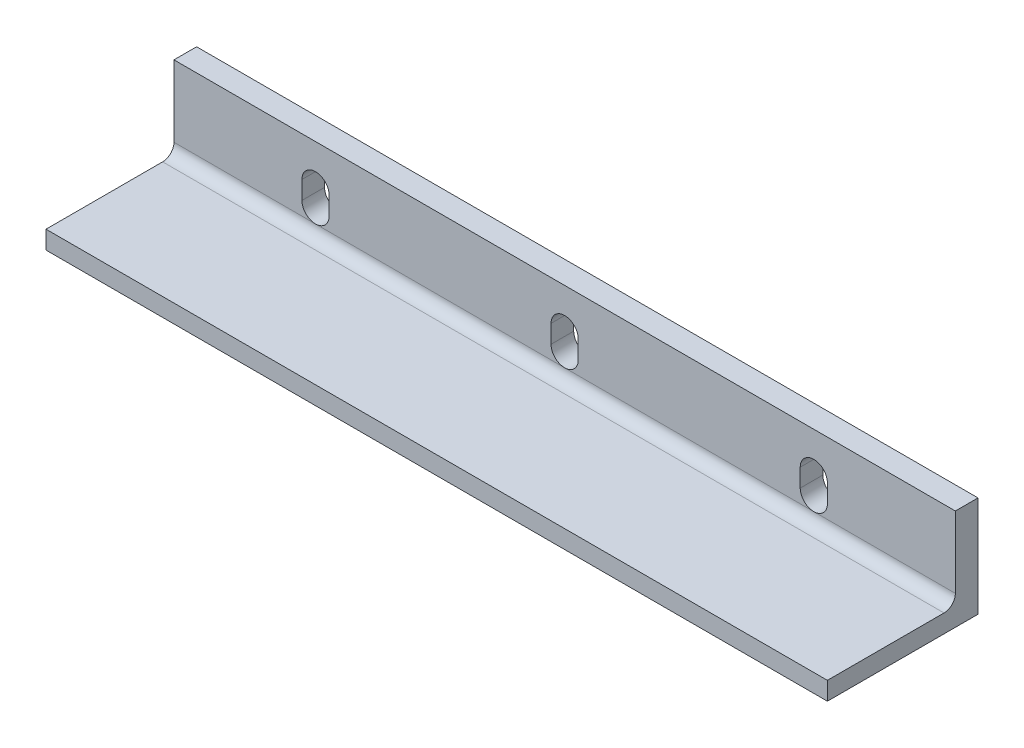
ISO-10303-21;
HEADER;
FILE_DESCRIPTION(('STEP AP214'),'2;1');
FILE_NAME('part.step','',(''),(''),'','','');
FILE_SCHEMA(('AUTOMOTIVE_DESIGN { 1 0 10303 214 1 1 1 1 }'));
ENDSEC;
DATA;
#1=APPLICATION_CONTEXT('core data for automotive mechanical design processes');
#2=APPLICATION_PROTOCOL_DEFINITION('international standard','automotive_design',2000,#1);
#3=PRODUCT_CONTEXT('',#1,'mechanical');
#4=PRODUCT('Part','Part','',(#3));
#5=PRODUCT_RELATED_PRODUCT_CATEGORY('part','',(#4));
#6=PRODUCT_DEFINITION_FORMATION('','',#4);
#7=PRODUCT_DEFINITION_CONTEXT('part definition',#1,'design');
#8=PRODUCT_DEFINITION('design','',#6,#7);
#9=PRODUCT_DEFINITION_SHAPE('','',#8);
#10=(LENGTH_UNIT() NAMED_UNIT(*) SI_UNIT(.MILLI.,.METRE.));
#11=(NAMED_UNIT(*) PLANE_ANGLE_UNIT() SI_UNIT($,.RADIAN.));
#12=(NAMED_UNIT(*) SI_UNIT($,.STERADIAN.) SOLID_ANGLE_UNIT());
#13=UNCERTAINTY_MEASURE_WITH_UNIT(LENGTH_MEASURE(1.E-05),#10,'distance_accuracy_value','');
#14=(GEOMETRIC_REPRESENTATION_CONTEXT(3) GLOBAL_UNCERTAINTY_ASSIGNED_CONTEXT((#13)) GLOBAL_UNIT_ASSIGNED_CONTEXT((#10,
#11,#12)) REPRESENTATION_CONTEXT('',''));
#15=CARTESIAN_POINT('',(0.,0.,0.));
#16=DIRECTION('',(0.,0.,1.));
#17=DIRECTION('',(1.,0.,0.));
#18=AXIS2_PLACEMENT_3D('',#15,#16,#17);
#19=CARTESIAN_POINT('',(-34.5,1.6,-6.65));
#20=DIRECTION('',(0.,0.,1.));
#21=DIRECTION('',(1.,0.,0.));
#22=AXIS2_PLACEMENT_3D('',#19,#20,#21);
#23=PLANE('',#22);
#24=DIRECTION('',(0.,1.,0.));
#25=VECTOR('',#24,1.);
#26=CARTESIAN_POINT('',(-23.2,3.8,-6.65));
#27=LINE('',#26,#25);
#28=CARTESIAN_POINT('',(-23.2,3.8,-6.65));
#29=VERTEX_POINT('',#28);
#30=CARTESIAN_POINT('',(-23.2,5.4,-6.65));
#31=VERTEX_POINT('',#30);
#32=EDGE_CURVE('E422',#29,#31,#27,.T.);
#33=ORIENTED_EDGE('',*,*,#32,.F.);
#34=CARTESIAN_POINT('',(-22.,3.8,-6.65));
#35=DIRECTION('',(0.,0.,1.));
#36=DIRECTION('',(1.,0.,0.));
#37=AXIS2_PLACEMENT_3D('',#34,#35,#36);
#38=CIRCLE('',#37,1.2);
#39=CARTESIAN_POINT('',(-20.8,3.8,-6.65));
#40=VERTEX_POINT('',#39);
#41=EDGE_CURVE('E427',#29,#40,#38,.T.);
#42=ORIENTED_EDGE('',*,*,#41,.T.);
#43=DIRECTION('',(0.,1.,0.));
#44=VECTOR('',#43,1.);
#45=CARTESIAN_POINT('',(-20.8,3.8,-6.65));
#46=LINE('',#45,#44);
#47=CARTESIAN_POINT('',(-20.8,5.4,-6.65));
#48=VERTEX_POINT('',#47);
#49=EDGE_CURVE('E413',#40,#48,#46,.T.);
#50=ORIENTED_EDGE('',*,*,#49,.T.);
#51=CARTESIAN_POINT('',(-22.,5.4,-6.65));
#52=DIRECTION('',(0.,0.,1.));
#53=DIRECTION('',(1.,0.,0.));
#54=AXIS2_PLACEMENT_3D('',#51,#52,#53);
#55=CIRCLE('',#54,1.2);
#56=EDGE_CURVE('E448',#48,#31,#55,.T.);
#57=ORIENTED_EDGE('',*,*,#56,.T.);
#58=EDGE_LOOP('',(#33,#42,#50,#57));
#59=FACE_BOUND('',#58,.T.);
#60=DIRECTION('',(0.,1.,0.));
#61=VECTOR('',#60,1.);
#62=CARTESIAN_POINT('',(20.8,3.80000000000001,-6.65));
#63=LINE('',#62,#61);
#64=CARTESIAN_POINT('',(20.8,3.80000000000001,-6.65));
#65=VERTEX_POINT('',#64);
#66=CARTESIAN_POINT('',(20.8,5.40000000000001,-6.65));
#67=VERTEX_POINT('',#66);
#68=EDGE_CURVE('E505',#65,#67,#63,.T.);
#69=ORIENTED_EDGE('',*,*,#68,.F.);
#70=CARTESIAN_POINT('',(22.,3.80000000000001,-6.65));
#71=DIRECTION('',(0.,0.,1.));
#72=DIRECTION('',(1.,0.,0.));
#73=AXIS2_PLACEMENT_3D('',#70,#71,#72);
#74=CIRCLE('',#73,1.2);
#75=CARTESIAN_POINT('',(23.2,3.80000000000001,-6.65));
#76=VERTEX_POINT('',#75);
#77=EDGE_CURVE('E521',#65,#76,#74,.T.);
#78=ORIENTED_EDGE('',*,*,#77,.T.);
#79=DIRECTION('',(0.,1.,0.));
#80=VECTOR('',#79,1.);
#81=CARTESIAN_POINT('',(23.2,3.80000000000001,-6.65));
#82=LINE('',#81,#80);
#83=CARTESIAN_POINT('',(23.2,5.40000000000001,-6.65));
#84=VERTEX_POINT('',#83);
#85=EDGE_CURVE('E501',#76,#84,#82,.T.);
#86=ORIENTED_EDGE('',*,*,#85,.T.);
#87=CARTESIAN_POINT('',(22.,5.40000000000001,-6.65));
#88=DIRECTION('',(0.,0.,1.));
#89=DIRECTION('',(1.,0.,0.));
#90=AXIS2_PLACEMENT_3D('',#87,#88,#89);
#91=CIRCLE('',#90,1.2);
#92=EDGE_CURVE('E535',#84,#67,#91,.T.);
#93=ORIENTED_EDGE('',*,*,#92,.T.);
#94=EDGE_LOOP('',(#69,#78,#86,#93));
#95=FACE_BOUND('',#94,.T.);
#96=DIRECTION('',(-1.,0.,0.));
#97=VECTOR('',#96,1.);
#98=CARTESIAN_POINT('',(-34.5,0.,-6.65));
#99=LINE('',#98,#97);
#100=CARTESIAN_POINT('',(34.5,0.,-6.65));
#101=VERTEX_POINT('',#100);
#102=CARTESIAN_POINT('',(-34.5,0.,-6.65));
#103=VERTEX_POINT('',#102);
#104=EDGE_CURVE('E581',#101,#103,#99,.T.);
#105=ORIENTED_EDGE('',*,*,#104,.T.);
#106=DIRECTION('',(0.,-1.,0.));
#107=VECTOR('',#106,1.);
#108=CARTESIAN_POINT('',(-34.5,1.6,-6.65));
#109=LINE('',#108,#107);
#110=CARTESIAN_POINT('',(-34.5,8.9,-6.65));
#111=VERTEX_POINT('',#110);
#112=EDGE_CURVE('E596',#111,#103,#109,.T.);
#113=ORIENTED_EDGE('',*,*,#112,.F.);
#114=DIRECTION('',(-1.,0.,0.));
#115=VECTOR('',#114,1.);
#116=CARTESIAN_POINT('',(-34.5,8.9,-6.65));
#117=LINE('',#116,#115);
#118=CARTESIAN_POINT('',(34.5,8.9,-6.65));
#119=VERTEX_POINT('',#118);
#120=EDGE_CURVE('E553',#119,#111,#117,.T.);
#121=ORIENTED_EDGE('',*,*,#120,.F.);
#122=DIRECTION('',(0.,-1.,0.));
#123=VECTOR('',#122,1.);
#124=CARTESIAN_POINT('',(34.5,1.6,-6.65));
#125=LINE('',#124,#123);
#126=EDGE_CURVE('E600',#119,#101,#125,.T.);
#127=ORIENTED_EDGE('',*,*,#126,.T.);
#128=EDGE_LOOP('',(#105,#113,#121,#127));
#129=FACE_BOUND('',#128,.T.);
#130=DIRECTION('',(0.,1.,0.));
#131=VECTOR('',#130,1.);
#132=CARTESIAN_POINT('',(-1.2,3.8,-6.65));
#133=LINE('',#132,#131);
#134=CARTESIAN_POINT('',(-1.2,3.8,-6.65));
#135=VERTEX_POINT('',#134);
#136=CARTESIAN_POINT('',(-1.2,5.4,-6.65));
#137=VERTEX_POINT('',#136);
#138=EDGE_CURVE('E461',#135,#137,#133,.T.);
#139=ORIENTED_EDGE('',*,*,#138,.F.);
#140=CARTESIAN_POINT('',(0.,3.8,-6.65));
#141=DIRECTION('',(0.,0.,1.));
#142=DIRECTION('',(1.,0.,0.));
#143=AXIS2_PLACEMENT_3D('',#140,#141,#142);
#144=CIRCLE('',#143,1.2);
#145=CARTESIAN_POINT('',(1.2,3.8,-6.65));
#146=VERTEX_POINT('',#145);
#147=EDGE_CURVE('E477',#135,#146,#144,.T.);
#148=ORIENTED_EDGE('',*,*,#147,.T.);
#149=DIRECTION('',(0.,1.,0.));
#150=VECTOR('',#149,1.);
#151=CARTESIAN_POINT('',(1.2,3.8,-6.65));
#152=LINE('',#151,#150);
#153=CARTESIAN_POINT('',(1.2,5.4,-6.65));
#154=VERTEX_POINT('',#153);
#155=EDGE_CURVE('E457',#146,#154,#152,.T.);
#156=ORIENTED_EDGE('',*,*,#155,.T.);
#157=CARTESIAN_POINT('',(0.,5.4,-6.65));
#158=DIRECTION('',(0.,0.,1.));
#159=DIRECTION('',(1.,0.,0.));
#160=AXIS2_PLACEMENT_3D('',#157,#158,#159);
#161=CIRCLE('',#160,1.2);
#162=EDGE_CURVE('E491',#154,#137,#161,.T.);
#163=ORIENTED_EDGE('',*,*,#162,.T.);
#164=EDGE_LOOP('',(#139,#148,#156,#163));
#165=FACE_BOUND('',#164,.T.);
#166=ADVANCED_FACE('F273',(#59,#95,#129,#165),#23,.F.);
#167=CARTESIAN_POINT('',(0.,1.6,0.));
#168=DIRECTION('',(0.,-1.,0.));
#169=DIRECTION('',(0.,0.,-1.));
#170=AXIS2_PLACEMENT_3D('',#167,#168,#169);
#171=PLANE('',#170);
#172=DIRECTION('',(0.,0.,-1.));
#173=VECTOR('',#172,1.);
#174=CARTESIAN_POINT('',(34.5,1.6,6.65));
#175=LINE('',#174,#173);
#176=CARTESIAN_POINT('',(34.5,1.6,6.65));
#177=VERTEX_POINT('',#176);
#178=CARTESIAN_POINT('',(34.5,1.6,-3.65));
#179=VERTEX_POINT('',#178);
#180=EDGE_CURVE('E566',#177,#179,#175,.T.);
#181=ORIENTED_EDGE('',*,*,#180,.T.);
#182=DIRECTION('',(1.,0.,0.));
#183=VECTOR('',#182,1.);
#184=CARTESIAN_POINT('',(-34.5,1.6,-3.65));
#185=LINE('',#184,#183);
#186=CARTESIAN_POINT('',(-34.5,1.6,-3.65));
#187=VERTEX_POINT('',#186);
#188=EDGE_CURVE('E609',#179,#187,#185,.F.);
#189=ORIENTED_EDGE('',*,*,#188,.T.);
#190=DIRECTION('',(0.,0.,1.));
#191=VECTOR('',#190,1.);
#192=CARTESIAN_POINT('',(-34.5,1.6,6.65));
#193=LINE('',#192,#191);
#194=CARTESIAN_POINT('',(-34.5,1.6,6.65));
#195=VERTEX_POINT('',#194);
#196=EDGE_CURVE('E570',#187,#195,#193,.T.);
#197=ORIENTED_EDGE('',*,*,#196,.T.);
#198=DIRECTION('',(1.,0.,0.));
#199=VECTOR('',#198,1.);
#200=CARTESIAN_POINT('',(-34.5,1.6,6.65));
#201=LINE('',#200,#199);
#202=EDGE_CURVE('E574',#195,#177,#201,.T.);
#203=ORIENTED_EDGE('',*,*,#202,.T.);
#204=EDGE_LOOP('',(#181,#189,#197,#203));
#205=FACE_BOUND('',#204,.T.);
#206=ADVANCED_FACE('F623',(#205),#171,.F.);
#207=CARTESIAN_POINT('',(34.5,1.6,6.65));
#208=DIRECTION('',(-1.,0.,0.));
#209=DIRECTION('',(0.,0.,1.));
#210=AXIS2_PLACEMENT_3D('',#207,#208,#209);
#211=PLANE('',#210);
#212=DIRECTION('',(0.,0.,-1.));
#213=VECTOR('',#212,1.);
#214=CARTESIAN_POINT('',(34.5,0.,6.65));
#215=LINE('',#214,#213);
#216=CARTESIAN_POINT('',(34.5,0.,6.65));
#217=VERTEX_POINT('',#216);
#218=EDGE_CURVE('E565',#217,#101,#215,.T.);
#219=ORIENTED_EDGE('',*,*,#218,.T.);
#220=ORIENTED_EDGE('',*,*,#126,.F.);
#221=DIRECTION('',(0.,0.,-1.));
#222=VECTOR('',#221,1.);
#223=CARTESIAN_POINT('',(34.5,8.9,-6.65));
#224=LINE('',#223,#222);
#225=CARTESIAN_POINT('',(34.5,8.9,-4.65));
#226=VERTEX_POINT('',#225);
#227=EDGE_CURVE('E549',#226,#119,#224,.T.);
#228=ORIENTED_EDGE('',*,*,#227,.F.);
#229=DIRECTION('',(0.,-1.,0.));
#230=VECTOR('',#229,1.);
#231=CARTESIAN_POINT('',(34.5,8.9,-4.65));
#232=LINE('',#231,#230);
#233=CARTESIAN_POINT('',(34.5,2.6,-4.65));
#234=VERTEX_POINT('',#233);
#235=EDGE_CURVE('E557',#226,#234,#232,.T.);
#236=ORIENTED_EDGE('',*,*,#235,.T.);
#237=CARTESIAN_POINT('',(34.5,2.6,-3.65));
#238=DIRECTION('',(-1.,0.,0.));
#239=DIRECTION('',(0.,0.,1.));
#240=AXIS2_PLACEMENT_3D('',#237,#238,#239);
#241=CIRCLE('',#240,1.);
#242=EDGE_CURVE('E282',#234,#179,#241,.T.);
#243=ORIENTED_EDGE('',*,*,#242,.T.);
#244=ORIENTED_EDGE('',*,*,#180,.F.);
#245=DIRECTION('',(0.,-1.,0.));
#246=VECTOR('',#245,1.);
#247=CARTESIAN_POINT('',(34.5,1.6,6.65));
#248=LINE('',#247,#246);
#249=EDGE_CURVE('E577',#177,#217,#248,.T.);
#250=ORIENTED_EDGE('',*,*,#249,.T.);
#251=EDGE_LOOP('',(#219,#220,#228,#236,#243,#244,#250));
#252=FACE_BOUND('',#251,.T.);
#253=ADVANCED_FACE('F616',(#252),#211,.F.);
#254=CARTESIAN_POINT('',(-34.5,1.6,6.65));
#255=DIRECTION('',(1.,0.,0.));
#256=DIRECTION('',(0.,0.,-1.));
#257=AXIS2_PLACEMENT_3D('',#254,#255,#256);
#258=PLANE('',#257);
#259=DIRECTION('',(0.,0.,1.));
#260=VECTOR('',#259,1.);
#261=CARTESIAN_POINT('',(-34.5,0.,6.65));
#262=LINE('',#261,#260);
#263=CARTESIAN_POINT('',(-34.5,0.,6.65));
#264=VERTEX_POINT('',#263);
#265=EDGE_CURVE('E584',#103,#264,#262,.T.);
#266=ORIENTED_EDGE('',*,*,#265,.T.);
#267=DIRECTION('',(0.,-1.,0.));
#268=VECTOR('',#267,1.);
#269=CARTESIAN_POINT('',(-34.5,1.6,6.65));
#270=LINE('',#269,#268);
#271=EDGE_CURVE('E592',#195,#264,#270,.T.);
#272=ORIENTED_EDGE('',*,*,#271,.F.);
#273=ORIENTED_EDGE('',*,*,#196,.F.);
#274=CARTESIAN_POINT('',(-34.5,2.6,-3.65));
#275=DIRECTION('',(1.,0.,0.));
#276=DIRECTION('',(0.,0.,-1.));
#277=AXIS2_PLACEMENT_3D('',#274,#275,#276);
#278=CIRCLE('',#277,1.);
#279=CARTESIAN_POINT('',(-34.5,2.6,-4.65));
#280=VERTEX_POINT('',#279);
#281=EDGE_CURVE('E15',#187,#280,#278,.T.);
#282=ORIENTED_EDGE('',*,*,#281,.T.);
#283=DIRECTION('',(0.,-1.,0.));
#284=VECTOR('',#283,1.);
#285=CARTESIAN_POINT('',(-34.5,8.9,-4.65));
#286=LINE('',#285,#284);
#287=CARTESIAN_POINT('',(-34.5,8.9,-4.65));
#288=VERTEX_POINT('',#287);
#289=EDGE_CURVE('E561',#288,#280,#286,.T.);
#290=ORIENTED_EDGE('',*,*,#289,.F.);
#291=DIRECTION('',(0.,0.,1.));
#292=VECTOR('',#291,1.);
#293=CARTESIAN_POINT('',(-34.5,8.9,-6.65));
#294=LINE('',#293,#292);
#295=EDGE_CURVE('E542',#111,#288,#294,.T.);
#296=ORIENTED_EDGE('',*,*,#295,.F.);
#297=ORIENTED_EDGE('',*,*,#112,.T.);
#298=EDGE_LOOP('',(#266,#272,#273,#282,#290,#296,#297));
#299=FACE_BOUND('',#298,.T.);
#300=ADVANCED_FACE('F632',(#299),#258,.F.);
#301=CARTESIAN_POINT('',(-34.5,1.6,6.65));
#302=DIRECTION('',(0.,0.,-1.));
#303=DIRECTION('',(-1.,0.,0.));
#304=AXIS2_PLACEMENT_3D('',#301,#302,#303);
#305=PLANE('',#304);
#306=DIRECTION('',(1.,0.,0.));
#307=VECTOR('',#306,1.);
#308=CARTESIAN_POINT('',(-34.5,0.,6.65));
#309=LINE('',#308,#307);
#310=EDGE_CURVE('E571',#264,#217,#309,.T.);
#311=ORIENTED_EDGE('',*,*,#310,.T.);
#312=ORIENTED_EDGE('',*,*,#249,.F.);
#313=ORIENTED_EDGE('',*,*,#202,.F.);
#314=ORIENTED_EDGE('',*,*,#271,.T.);
#315=EDGE_LOOP('',(#311,#312,#313,#314));
#316=FACE_BOUND('',#315,.T.);
#317=ADVANCED_FACE('F648',(#316),#305,.F.);
#318=CARTESIAN_POINT('',(0.,0.,0.));
#319=DIRECTION('',(0.,-1.,0.));
#320=DIRECTION('',(0.,0.,-1.));
#321=AXIS2_PLACEMENT_3D('',#318,#319,#320);
#322=PLANE('',#321);
#323=ORIENTED_EDGE('',*,*,#218,.F.);
#324=ORIENTED_EDGE('',*,*,#310,.F.);
#325=ORIENTED_EDGE('',*,*,#265,.F.);
#326=ORIENTED_EDGE('',*,*,#104,.F.);
#327=EDGE_LOOP('',(#323,#324,#325,#326));
#328=FACE_BOUND('',#327,.T.);
#329=ADVANCED_FACE('F646',(#328),#322,.T.);
#330=CARTESIAN_POINT('',(-34.5,8.9,-4.65));
#331=DIRECTION('',(0.,0.,-1.));
#332=DIRECTION('',(-1.,0.,0.));
#333=AXIS2_PLACEMENT_3D('',#330,#331,#332);
#334=PLANE('',#333);
#335=CARTESIAN_POINT('',(-22.,5.4,-4.65));
#336=DIRECTION('',(0.,0.,1.));
#337=DIRECTION('',(1.,0.,0.));
#338=AXIS2_PLACEMENT_3D('',#335,#336,#337);
#339=CIRCLE('',#338,1.2);
#340=CARTESIAN_POINT('',(-20.7999999999999,5.4,-4.65));
#341=VERTEX_POINT('',#340);
#342=CARTESIAN_POINT('',(-23.2,5.4,-4.65));
#343=VERTEX_POINT('',#342);
#344=EDGE_CURVE('E444',#341,#343,#339,.T.);
#345=ORIENTED_EDGE('',*,*,#344,.F.);
#346=DIRECTION('',(0.,1.,0.));
#347=VECTOR('',#346,1.);
#348=CARTESIAN_POINT('',(-20.7999999999999,3.8,-4.65));
#349=LINE('',#348,#347);
#350=CARTESIAN_POINT('',(-20.8,3.8,-4.65));
#351=VERTEX_POINT('',#350);
#352=EDGE_CURVE('E423',#351,#341,#349,.T.);
#353=ORIENTED_EDGE('',*,*,#352,.F.);
#354=CARTESIAN_POINT('',(-22.,3.8,-4.65));
#355=DIRECTION('',(0.,0.,1.));
#356=DIRECTION('',(1.,0.,0.));
#357=AXIS2_PLACEMENT_3D('',#354,#355,#356);
#358=CIRCLE('',#357,1.2);
#359=CARTESIAN_POINT('',(-22.,2.6,-4.65));
#360=VERTEX_POINT('',#359);
#361=EDGE_CURVE('E429',#360,#351,#358,.T.);
#362=ORIENTED_EDGE('',*,*,#361,.F.);
#363=DIRECTION('',(1.,0.,0.));
#364=VECTOR('',#363,1.);
#365=CARTESIAN_POINT('',(34.5,2.6,-4.65));
#366=LINE('',#365,#364);
#367=CARTESIAN_POINT('',(0.,2.6,-4.65));
#368=VERTEX_POINT('',#367);
#369=EDGE_CURVE('E610',#360,#368,#366,.T.);
#370=ORIENTED_EDGE('',*,*,#369,.T.);
#371=CARTESIAN_POINT('',(0.,3.8,-4.65));
#372=DIRECTION('',(0.,0.,1.));
#373=DIRECTION('',(1.,0.,0.));
#374=AXIS2_PLACEMENT_3D('',#371,#372,#373);
#375=CIRCLE('',#374,1.2);
#376=CARTESIAN_POINT('',(-1.20000000000006,3.8,-4.65));
#377=VERTEX_POINT('',#376);
#378=EDGE_CURVE('E473',#377,#368,#375,.T.);
#379=ORIENTED_EDGE('',*,*,#378,.F.);
#380=DIRECTION('',(0.,1.,0.));
#381=VECTOR('',#380,1.);
#382=CARTESIAN_POINT('',(-1.2,3.8,-4.65));
#383=LINE('',#382,#381);
#384=CARTESIAN_POINT('',(-1.2,5.4,-4.65));
#385=VERTEX_POINT('',#384);
#386=EDGE_CURVE('E464',#377,#385,#383,.T.);
#387=ORIENTED_EDGE('',*,*,#386,.T.);
#388=CARTESIAN_POINT('',(0.,5.4,-4.65));
#389=DIRECTION('',(0.,0.,1.));
#390=DIRECTION('',(1.,0.,0.));
#391=AXIS2_PLACEMENT_3D('',#388,#389,#390);
#392=CIRCLE('',#391,1.2);
#393=CARTESIAN_POINT('',(1.20000000000006,5.4,-4.65));
#394=VERTEX_POINT('',#393);
#395=EDGE_CURVE('E487',#394,#385,#392,.T.);
#396=ORIENTED_EDGE('',*,*,#395,.F.);
#397=DIRECTION('',(0.,1.,0.));
#398=VECTOR('',#397,1.);
#399=CARTESIAN_POINT('',(1.20000000000006,3.8,-4.65));
#400=LINE('',#399,#398);
#401=CARTESIAN_POINT('',(1.2,3.8,-4.65));
#402=VERTEX_POINT('',#401);
#403=EDGE_CURVE('E454',#402,#394,#400,.T.);
#404=ORIENTED_EDGE('',*,*,#403,.F.);
#405=EDGE_CURVE('E472',#368,#402,#375,.T.);
#406=ORIENTED_EDGE('',*,*,#405,.F.);
#407=CARTESIAN_POINT('',(22.,2.6,-4.65));
#408=VERTEX_POINT('',#407);
#409=EDGE_CURVE('E673',#368,#408,#366,.T.);
#410=ORIENTED_EDGE('',*,*,#409,.T.);
#411=CARTESIAN_POINT('',(22.,3.80000000000001,-4.65));
#412=DIRECTION('',(0.,0.,1.));
#413=DIRECTION('',(1.,0.,0.));
#414=AXIS2_PLACEMENT_3D('',#411,#412,#413);
#415=CIRCLE('',#414,1.2);
#416=CARTESIAN_POINT('',(20.8,3.80000000000001,-4.65));
#417=VERTEX_POINT('',#416);
#418=EDGE_CURVE('E517',#417,#408,#415,.T.);
#419=ORIENTED_EDGE('',*,*,#418,.F.);
#420=DIRECTION('',(0.,1.,0.));
#421=VECTOR('',#420,1.);
#422=CARTESIAN_POINT('',(20.8,3.80000000000001,-4.65));
#423=LINE('',#422,#421);
#424=CARTESIAN_POINT('',(20.8,5.40000000000001,-4.65));
#425=VERTEX_POINT('',#424);
#426=EDGE_CURVE('E508',#417,#425,#423,.T.);
#427=ORIENTED_EDGE('',*,*,#426,.T.);
#428=CARTESIAN_POINT('',(22.,5.40000000000001,-4.65));
#429=DIRECTION('',(0.,0.,1.));
#430=DIRECTION('',(1.,0.,0.));
#431=AXIS2_PLACEMENT_3D('',#428,#429,#430);
#432=CIRCLE('',#431,1.2);
#433=CARTESIAN_POINT('',(23.2000000000001,5.40000000000001,-4.65));
#434=VERTEX_POINT('',#433);
#435=EDGE_CURVE('E531',#434,#425,#432,.T.);
#436=ORIENTED_EDGE('',*,*,#435,.F.);
#437=DIRECTION('',(0.,1.,0.));
#438=VECTOR('',#437,1.);
#439=CARTESIAN_POINT('',(23.2000000000001,3.80000000000001,-4.65));
#440=LINE('',#439,#438);
#441=CARTESIAN_POINT('',(23.2,3.80000000000001,-4.65));
#442=VERTEX_POINT('',#441);
#443=EDGE_CURVE('E498',#442,#434,#440,.T.);
#444=ORIENTED_EDGE('',*,*,#443,.F.);
#445=EDGE_CURVE('E516',#408,#442,#415,.T.);
#446=ORIENTED_EDGE('',*,*,#445,.F.);
#447=EDGE_CURVE('E604',#408,#234,#366,.T.);
#448=ORIENTED_EDGE('',*,*,#447,.T.);
#449=ORIENTED_EDGE('',*,*,#235,.F.);
#450=DIRECTION('',(1.,0.,0.));
#451=VECTOR('',#450,1.);
#452=CARTESIAN_POINT('',(-34.5,8.9,-4.65));
#453=LINE('',#452,#451);
#454=EDGE_CURVE('E546',#288,#226,#453,.T.);
#455=ORIENTED_EDGE('',*,*,#454,.F.);
#456=ORIENTED_EDGE('',*,*,#289,.T.);
#457=EDGE_CURVE('E605',#280,#360,#366,.T.);
#458=ORIENTED_EDGE('',*,*,#457,.T.);
#459=CARTESIAN_POINT('',(-23.2,3.8,-4.65));
#460=VERTEX_POINT('',#459);
#461=EDGE_CURVE('E297',#460,#360,#358,.T.);
#462=ORIENTED_EDGE('',*,*,#461,.F.);
#463=DIRECTION('',(0.,1.,0.));
#464=VECTOR('',#463,1.);
#465=CARTESIAN_POINT('',(-23.2,3.8,-4.65));
#466=LINE('',#465,#464);
#467=EDGE_CURVE('E431',#460,#343,#466,.T.);
#468=ORIENTED_EDGE('',*,*,#467,.T.);
#469=EDGE_LOOP('',(#345,#353,#362,#370,#379,#387,#396,#404,#406,#410,#419,#427,#436,#444,#446,
#448,#449,#455,#456,#458,#462,#468));
#470=FACE_BOUND('',#469,.T.);
#471=ADVANCED_FACE('F637',(#470),#334,.F.);
#472=CARTESIAN_POINT('',(0.,8.9,0.));
#473=DIRECTION('',(0.,1.,0.));
#474=DIRECTION('',(0.,0.,1.));
#475=AXIS2_PLACEMENT_3D('',#472,#473,#474);
#476=PLANE('',#475);
#477=ORIENTED_EDGE('',*,*,#295,.T.);
#478=ORIENTED_EDGE('',*,*,#454,.T.);
#479=ORIENTED_EDGE('',*,*,#227,.T.);
#480=ORIENTED_EDGE('',*,*,#120,.T.);
#481=EDGE_LOOP('',(#477,#478,#479,#480));
#482=FACE_BOUND('',#481,.T.);
#483=ADVANCED_FACE('F639',(#482),#476,.T.);
#484=CARTESIAN_POINT('',(-34.5,2.6,-3.65));
#485=DIRECTION('',(-1.,0.,0.));
#486=DIRECTION('',(0.,0.,1.));
#487=AXIS2_PLACEMENT_3D('',#484,#485,#486);
#488=CYLINDRICAL_SURFACE('',#487,1.);
#489=ORIENTED_EDGE('',*,*,#281,.F.);
#490=ORIENTED_EDGE('',*,*,#188,.F.);
#491=ORIENTED_EDGE('',*,*,#242,.F.);
#492=ORIENTED_EDGE('',*,*,#447,.F.);
#493=ORIENTED_EDGE('',*,*,#409,.F.);
#494=ORIENTED_EDGE('',*,*,#369,.F.);
#495=ORIENTED_EDGE('',*,*,#457,.F.);
#496=EDGE_LOOP('',(#489,#490,#491,#492,#493,#494,#495));
#497=FACE_BOUND('',#496,.T.);
#498=ADVANCED_FACE('F275',(#497),#488,.F.);
#499=CARTESIAN_POINT('',(22.,5.40000000000001,-4.65));
#500=DIRECTION('',(0.,0.,1.));
#501=DIRECTION('',(1.,0.,0.));
#502=AXIS2_PLACEMENT_3D('',#499,#500,#501);
#503=CYLINDRICAL_SURFACE('',#502,1.2);
#504=ORIENTED_EDGE('',*,*,#92,.F.);
#505=DIRECTION('',(0.,0.,-1.));
#506=VECTOR('',#505,1.);
#507=CARTESIAN_POINT('',(23.2,5.40000000000001,-6.65));
#508=LINE('',#507,#506);
#509=EDGE_CURVE('E528',#434,#84,#508,.T.);
#510=ORIENTED_EDGE('',*,*,#509,.F.);
#511=ORIENTED_EDGE('',*,*,#435,.T.);
#512=DIRECTION('',(0.,0.,1.));
#513=VECTOR('',#512,1.);
#514=CARTESIAN_POINT('',(20.8,5.40000000000001,-4.65));
#515=LINE('',#514,#513);
#516=EDGE_CURVE('E539',#67,#425,#515,.T.);
#517=ORIENTED_EDGE('',*,*,#516,.F.);
#518=EDGE_LOOP('',(#504,#510,#511,#517));
#519=FACE_BOUND('',#518,.T.);
#520=ADVANCED_FACE('F696',(#519),#503,.F.);
#521=CARTESIAN_POINT('',(22.,3.80000000000001,-4.65));
#522=DIRECTION('',(0.,0.,1.));
#523=DIRECTION('',(1.,0.,0.));
#524=AXIS2_PLACEMENT_3D('',#521,#522,#523);
#525=CYLINDRICAL_SURFACE('',#524,1.2);
#526=ORIENTED_EDGE('',*,*,#418,.T.);
#527=ORIENTED_EDGE('',*,*,#445,.T.);
#528=DIRECTION('',(0.,0.,-1.));
#529=VECTOR('',#528,1.);
#530=CARTESIAN_POINT('',(23.2,3.80000000000001,-6.65));
#531=LINE('',#530,#529);
#532=EDGE_CURVE('E512',#442,#76,#531,.T.);
#533=ORIENTED_EDGE('',*,*,#532,.T.);
#534=ORIENTED_EDGE('',*,*,#77,.F.);
#535=DIRECTION('',(0.,0.,1.));
#536=VECTOR('',#535,1.);
#537=CARTESIAN_POINT('',(20.8,3.80000000000001,-4.65));
#538=LINE('',#537,#536);
#539=EDGE_CURVE('E525',#417,#65,#538,.F.);
#540=ORIENTED_EDGE('',*,*,#539,.F.);
#541=EDGE_LOOP('',(#526,#527,#533,#534,#540));
#542=FACE_BOUND('',#541,.T.);
#543=ADVANCED_FACE('F684',(#542),#525,.F.);
#544=CARTESIAN_POINT('',(20.8,3.80000000000001,-4.65));
#545=DIRECTION('',(-1.,0.,0.));
#546=DIRECTION('',(0.,0.,1.));
#547=AXIS2_PLACEMENT_3D('',#544,#545,#546);
#548=PLANE('',#547);
#549=ORIENTED_EDGE('',*,*,#516,.T.);
#550=ORIENTED_EDGE('',*,*,#426,.F.);
#551=ORIENTED_EDGE('',*,*,#539,.T.);
#552=ORIENTED_EDGE('',*,*,#68,.T.);
#553=EDGE_LOOP('',(#549,#550,#551,#552));
#554=FACE_BOUND('',#553,.T.);
#555=ADVANCED_FACE('F693',(#554),#548,.F.);
#556=CARTESIAN_POINT('',(23.2,3.80000000000001,-6.65));
#557=DIRECTION('',(1.,0.,0.));
#558=DIRECTION('',(0.,0.,-1.));
#559=AXIS2_PLACEMENT_3D('',#556,#557,#558);
#560=PLANE('',#559);
#561=ORIENTED_EDGE('',*,*,#509,.T.);
#562=ORIENTED_EDGE('',*,*,#85,.F.);
#563=ORIENTED_EDGE('',*,*,#532,.F.);
#564=ORIENTED_EDGE('',*,*,#443,.T.);
#565=EDGE_LOOP('',(#561,#562,#563,#564));
#566=FACE_BOUND('',#565,.T.);
#567=ADVANCED_FACE('F687',(#566),#560,.F.);
#568=CARTESIAN_POINT('',(0.,5.4,-4.65));
#569=DIRECTION('',(0.,0.,1.));
#570=DIRECTION('',(1.,0.,0.));
#571=AXIS2_PLACEMENT_3D('',#568,#569,#570);
#572=CYLINDRICAL_SURFACE('',#571,1.2);
#573=ORIENTED_EDGE('',*,*,#162,.F.);
#574=DIRECTION('',(0.,0.,-1.));
#575=VECTOR('',#574,1.);
#576=CARTESIAN_POINT('',(1.2,5.4,-6.65));
#577=LINE('',#576,#575);
#578=EDGE_CURVE('E484',#394,#154,#577,.T.);
#579=ORIENTED_EDGE('',*,*,#578,.F.);
#580=ORIENTED_EDGE('',*,*,#395,.T.);
#581=DIRECTION('',(0.,0.,1.));
#582=VECTOR('',#581,1.);
#583=CARTESIAN_POINT('',(-1.2,5.4,-4.65));
#584=LINE('',#583,#582);
#585=EDGE_CURVE('E495',#137,#385,#584,.T.);
#586=ORIENTED_EDGE('',*,*,#585,.F.);
#587=EDGE_LOOP('',(#573,#579,#580,#586));
#588=FACE_BOUND('',#587,.T.);
#589=ADVANCED_FACE('F660',(#588),#572,.F.);
#590=CARTESIAN_POINT('',(0.,3.8,-4.65));
#591=DIRECTION('',(0.,0.,1.));
#592=DIRECTION('',(1.,0.,0.));
#593=AXIS2_PLACEMENT_3D('',#590,#591,#592);
#594=CYLINDRICAL_SURFACE('',#593,1.2);
#595=ORIENTED_EDGE('',*,*,#378,.T.);
#596=ORIENTED_EDGE('',*,*,#405,.T.);
#597=DIRECTION('',(0.,0.,-1.));
#598=VECTOR('',#597,1.);
#599=CARTESIAN_POINT('',(1.2,3.8,-6.65));
#600=LINE('',#599,#598);
#601=EDGE_CURVE('E468',#402,#146,#600,.T.);
#602=ORIENTED_EDGE('',*,*,#601,.T.);
#603=ORIENTED_EDGE('',*,*,#147,.F.);
#604=DIRECTION('',(0.,0.,1.));
#605=VECTOR('',#604,1.);
#606=CARTESIAN_POINT('',(-1.2,3.8,-4.65));
#607=LINE('',#606,#605);
#608=EDGE_CURVE('E481',#377,#135,#607,.F.);
#609=ORIENTED_EDGE('',*,*,#608,.F.);
#610=EDGE_LOOP('',(#595,#596,#602,#603,#609));
#611=FACE_BOUND('',#610,.T.);
#612=ADVANCED_FACE('F666',(#611),#594,.F.);
#613=CARTESIAN_POINT('',(-1.2,3.8,-4.65));
#614=DIRECTION('',(-1.,0.,0.));
#615=DIRECTION('',(0.,0.,1.));
#616=AXIS2_PLACEMENT_3D('',#613,#614,#615);
#617=PLANE('',#616);
#618=ORIENTED_EDGE('',*,*,#585,.T.);
#619=ORIENTED_EDGE('',*,*,#386,.F.);
#620=ORIENTED_EDGE('',*,*,#608,.T.);
#621=ORIENTED_EDGE('',*,*,#138,.T.);
#622=EDGE_LOOP('',(#618,#619,#620,#621));
#623=FACE_BOUND('',#622,.T.);
#624=ADVANCED_FACE('F657',(#623),#617,.F.);
#625=CARTESIAN_POINT('',(1.2,3.8,-6.65));
#626=DIRECTION('',(1.,0.,0.));
#627=DIRECTION('',(0.,0.,-1.));
#628=AXIS2_PLACEMENT_3D('',#625,#626,#627);
#629=PLANE('',#628);
#630=ORIENTED_EDGE('',*,*,#578,.T.);
#631=ORIENTED_EDGE('',*,*,#155,.F.);
#632=ORIENTED_EDGE('',*,*,#601,.F.);
#633=ORIENTED_EDGE('',*,*,#403,.T.);
#634=EDGE_LOOP('',(#630,#631,#632,#633));
#635=FACE_BOUND('',#634,.T.);
#636=ADVANCED_FACE('F670',(#635),#629,.F.);
#637=CARTESIAN_POINT('',(-22.,5.4,-4.65));
#638=DIRECTION('',(0.,0.,1.));
#639=DIRECTION('',(1.,0.,0.));
#640=AXIS2_PLACEMENT_3D('',#637,#638,#639);
#641=CYLINDRICAL_SURFACE('',#640,1.2);
#642=ORIENTED_EDGE('',*,*,#56,.F.);
#643=DIRECTION('',(0.,0.,-1.));
#644=VECTOR('',#643,1.);
#645=CARTESIAN_POINT('',(-20.8,5.4,-6.65));
#646=LINE('',#645,#644);
#647=EDGE_CURVE('E289',#341,#48,#646,.T.);
#648=ORIENTED_EDGE('',*,*,#647,.F.);
#649=ORIENTED_EDGE('',*,*,#344,.T.);
#650=DIRECTION('',(0.,0.,1.));
#651=VECTOR('',#650,1.);
#652=CARTESIAN_POINT('',(-23.2,5.4,-4.65));
#653=LINE('',#652,#651);
#654=EDGE_CURVE('E451',#31,#343,#653,.T.);
#655=ORIENTED_EDGE('',*,*,#654,.F.);
#656=EDGE_LOOP('',(#642,#648,#649,#655));
#657=FACE_BOUND('',#656,.T.);
#658=ADVANCED_FACE('F807',(#657),#641,.F.);
#659=CARTESIAN_POINT('',(-22.,3.8,-4.65));
#660=DIRECTION('',(0.,0.,1.));
#661=DIRECTION('',(1.,0.,0.));
#662=AXIS2_PLACEMENT_3D('',#659,#660,#661);
#663=CYLINDRICAL_SURFACE('',#662,1.2);
#664=ORIENTED_EDGE('',*,*,#461,.T.);
#665=ORIENTED_EDGE('',*,*,#361,.T.);
#666=DIRECTION('',(0.,0.,-1.));
#667=VECTOR('',#666,1.);
#668=CARTESIAN_POINT('',(-20.8,3.8,-6.65));
#669=LINE('',#668,#667);
#670=EDGE_CURVE('E416',#351,#40,#669,.T.);
#671=ORIENTED_EDGE('',*,*,#670,.T.);
#672=ORIENTED_EDGE('',*,*,#41,.F.);
#673=DIRECTION('',(0.,0.,1.));
#674=VECTOR('',#673,1.);
#675=CARTESIAN_POINT('',(-23.2,3.8,-4.65));
#676=LINE('',#675,#674);
#677=EDGE_CURVE('E435',#460,#29,#676,.F.);
#678=ORIENTED_EDGE('',*,*,#677,.F.);
#679=EDGE_LOOP('',(#664,#665,#671,#672,#678));
#680=FACE_BOUND('',#679,.T.);
#681=ADVANCED_FACE('F426',(#680),#663,.F.);
#682=CARTESIAN_POINT('',(-23.2,3.8,-4.65));
#683=DIRECTION('',(-1.,0.,0.));
#684=DIRECTION('',(0.,0.,1.));
#685=AXIS2_PLACEMENT_3D('',#682,#683,#684);
#686=PLANE('',#685);
#687=ORIENTED_EDGE('',*,*,#654,.T.);
#688=ORIENTED_EDGE('',*,*,#467,.F.);
#689=ORIENTED_EDGE('',*,*,#677,.T.);
#690=ORIENTED_EDGE('',*,*,#32,.T.);
#691=EDGE_LOOP('',(#687,#688,#689,#690));
#692=FACE_BOUND('',#691,.T.);
#693=ADVANCED_FACE('F825',(#692),#686,.F.);
#694=CARTESIAN_POINT('',(-20.8,3.8,-6.65));
#695=DIRECTION('',(1.,0.,0.));
#696=DIRECTION('',(0.,0.,-1.));
#697=AXIS2_PLACEMENT_3D('',#694,#695,#696);
#698=PLANE('',#697);
#699=ORIENTED_EDGE('',*,*,#647,.T.);
#700=ORIENTED_EDGE('',*,*,#49,.F.);
#701=ORIENTED_EDGE('',*,*,#670,.F.);
#702=ORIENTED_EDGE('',*,*,#352,.T.);
#703=EDGE_LOOP('',(#699,#700,#701,#702));
#704=FACE_BOUND('',#703,.T.);
#705=ADVANCED_FACE('F415',(#704),#698,.F.);
#706=CLOSED_SHELL('',(#166,#206,#253,#300,#317,#329,#471,#483,#498,#520,#543,#555,#567,#589,
#612,#624,#636,#658,#681,#693,#705));
#707=MANIFOLD_SOLID_BREP('B2',#706);
#708=ADVANCED_BREP_SHAPE_REPRESENTATION('',(#18,#707),#14);
#709=SHAPE_DEFINITION_REPRESENTATION(#9,#708);
ENDSEC;
END-ISO-10303-21;
